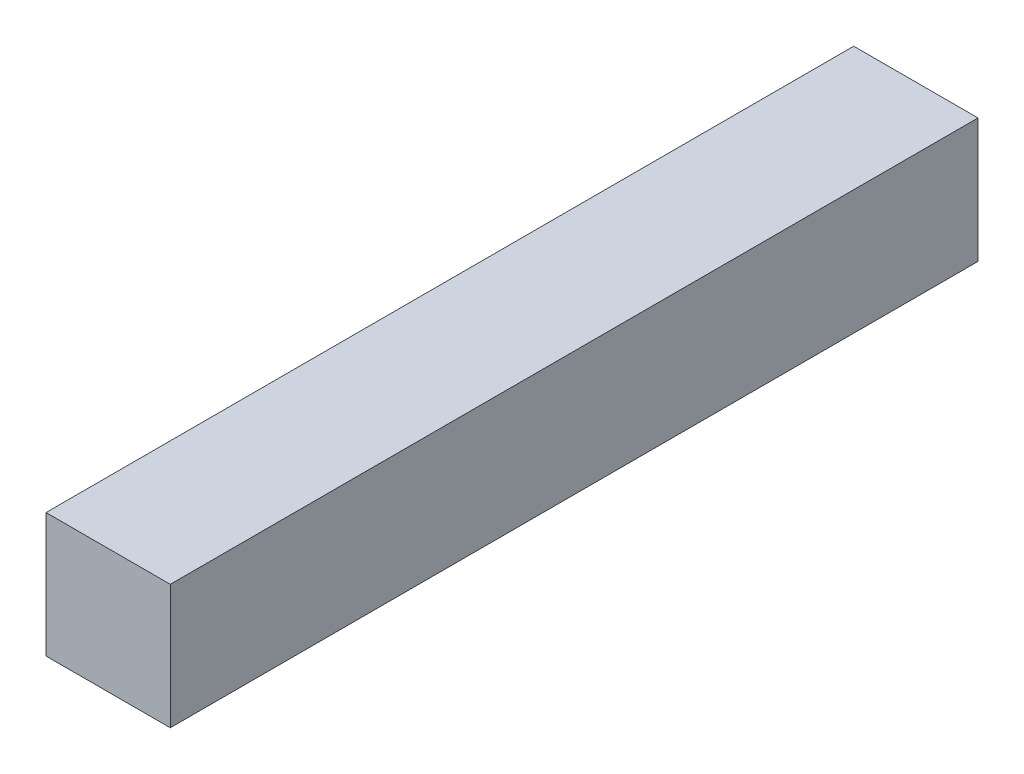
ISO-10303-21;
HEADER;
FILE_DESCRIPTION(('STEP AP214'),'2;1');
FILE_NAME('part.step','',(''),(''),'','','');
FILE_SCHEMA(('AUTOMOTIVE_DESIGN { 1 0 10303 214 1 1 1 1 }'));
ENDSEC;
DATA;
#1=APPLICATION_CONTEXT('core data for automotive mechanical design processes');
#2=APPLICATION_PROTOCOL_DEFINITION('international standard','automotive_design',2000,#1);
#3=PRODUCT_CONTEXT('',#1,'mechanical');
#4=PRODUCT('Part','Part','',(#3));
#5=PRODUCT_RELATED_PRODUCT_CATEGORY('part','',(#4));
#6=PRODUCT_DEFINITION_FORMATION('','',#4);
#7=PRODUCT_DEFINITION_CONTEXT('part definition',#1,'design');
#8=PRODUCT_DEFINITION('design','',#6,#7);
#9=PRODUCT_DEFINITION_SHAPE('','',#8);
#10=(LENGTH_UNIT() NAMED_UNIT(*) SI_UNIT(.MILLI.,.METRE.));
#11=(NAMED_UNIT(*) PLANE_ANGLE_UNIT() SI_UNIT($,.RADIAN.));
#12=(NAMED_UNIT(*) SI_UNIT($,.STERADIAN.) SOLID_ANGLE_UNIT());
#13=UNCERTAINTY_MEASURE_WITH_UNIT(LENGTH_MEASURE(1.E-05),#10,'distance_accuracy_value','');
#14=(GEOMETRIC_REPRESENTATION_CONTEXT(3) GLOBAL_UNCERTAINTY_ASSIGNED_CONTEXT((#13)) GLOBAL_UNIT_ASSIGNED_CONTEXT((#10,
#11,#12)) REPRESENTATION_CONTEXT('',''));
#15=CARTESIAN_POINT('',(0.,0.,0.));
#16=DIRECTION('',(0.,0.,1.));
#17=DIRECTION('',(1.,0.,0.));
#18=AXIS2_PLACEMENT_3D('',#15,#16,#17);
#19=CARTESIAN_POINT('',(10.,-10.,130.));
#20=DIRECTION('',(-1.,0.,0.));
#21=DIRECTION('',(0.,-1.,0.));
#22=AXIS2_PLACEMENT_3D('',#19,#20,#21);
#23=PLANE('',#22);
#24=DIRECTION('',(0.,1.,0.));
#25=VECTOR('',#24,1.);
#26=CARTESIAN_POINT('',(10.,-10.,0.));
#27=LINE('',#26,#25);
#28=CARTESIAN_POINT('',(10.,-10.,0.));
#29=VERTEX_POINT('',#28);
#30=CARTESIAN_POINT('',(10.,10.,0.));
#31=VERTEX_POINT('',#30);
#32=EDGE_CURVE('E107',#29,#31,#27,.T.);
#33=ORIENTED_EDGE('',*,*,#32,.T.);
#34=DIRECTION('',(0.,0.,-1.));
#35=VECTOR('',#34,1.);
#36=CARTESIAN_POINT('',(10.,10.,130.));
#37=LINE('',#36,#35);
#38=CARTESIAN_POINT('',(10.,10.,130.));
#39=VERTEX_POINT('',#38);
#40=EDGE_CURVE('E11',#39,#31,#37,.T.);
#41=ORIENTED_EDGE('',*,*,#40,.F.);
#42=DIRECTION('',(0.,1.,0.));
#43=VECTOR('',#42,1.);
#44=CARTESIAN_POINT('',(10.,-10.,130.));
#45=LINE('',#44,#43);
#46=CARTESIAN_POINT('',(10.,-10.,130.));
#47=VERTEX_POINT('',#46);
#48=EDGE_CURVE('E91',#47,#39,#45,.T.);
#49=ORIENTED_EDGE('',*,*,#48,.F.);
#50=DIRECTION('',(0.,0.,-1.));
#51=VECTOR('',#50,1.);
#52=CARTESIAN_POINT('',(10.,-10.,130.));
#53=LINE('',#52,#51);
#54=EDGE_CURVE('E103',#47,#29,#53,.T.);
#55=ORIENTED_EDGE('',*,*,#54,.T.);
#56=EDGE_LOOP('',(#33,#41,#49,#55));
#57=FACE_BOUND('',#56,.T.);
#58=ADVANCED_FACE('F39',(#57),#23,.F.);
#59=CARTESIAN_POINT('',(-10.,10.,130.));
#60=DIRECTION('',(0.,-1.,0.));
#61=DIRECTION('',(1.,0.,0.));
#62=AXIS2_PLACEMENT_3D('',#59,#60,#61);
#63=PLANE('',#62);
#64=DIRECTION('',(-1.,0.,0.));
#65=VECTOR('',#64,1.);
#66=CARTESIAN_POINT('',(-10.,10.,0.));
#67=LINE('',#66,#65);
#68=CARTESIAN_POINT('',(-10.,10.,0.));
#69=VERTEX_POINT('',#68);
#70=EDGE_CURVE('E96',#31,#69,#67,.T.);
#71=ORIENTED_EDGE('',*,*,#70,.T.);
#72=DIRECTION('',(0.,0.,-1.));
#73=VECTOR('',#72,1.);
#74=CARTESIAN_POINT('',(-10.,10.,130.));
#75=LINE('',#74,#73);
#76=CARTESIAN_POINT('',(-10.,10.,130.));
#77=VERTEX_POINT('',#76);
#78=EDGE_CURVE('E48',#77,#69,#75,.T.);
#79=ORIENTED_EDGE('',*,*,#78,.F.);
#80=DIRECTION('',(-1.,0.,0.));
#81=VECTOR('',#80,1.);
#82=CARTESIAN_POINT('',(-10.,10.,130.));
#83=LINE('',#82,#81);
#84=EDGE_CURVE('E86',#39,#77,#83,.T.);
#85=ORIENTED_EDGE('',*,*,#84,.F.);
#86=ORIENTED_EDGE('',*,*,#40,.T.);
#87=EDGE_LOOP('',(#71,#79,#85,#86));
#88=FACE_BOUND('',#87,.T.);
#89=ADVANCED_FACE('F95',(#88),#63,.F.);
#90=CARTESIAN_POINT('',(-10.,-10.,130.));
#91=DIRECTION('',(1.,0.,0.));
#92=DIRECTION('',(0.,0.,-1.));
#93=AXIS2_PLACEMENT_3D('',#90,#91,#92);
#94=PLANE('',#93);
#95=DIRECTION('',(0.,-1.,0.));
#96=VECTOR('',#95,1.);
#97=CARTESIAN_POINT('',(-10.,-10.,0.));
#98=LINE('',#97,#96);
#99=CARTESIAN_POINT('',(-10.,-10.,0.));
#100=VERTEX_POINT('',#99);
#101=EDGE_CURVE('E73',#69,#100,#98,.T.);
#102=ORIENTED_EDGE('',*,*,#101,.T.);
#103=DIRECTION('',(0.,0.,-1.));
#104=VECTOR('',#103,1.);
#105=CARTESIAN_POINT('',(-10.,-10.,130.));
#106=LINE('',#105,#104);
#107=CARTESIAN_POINT('',(-10.,-10.,130.));
#108=VERTEX_POINT('',#107);
#109=EDGE_CURVE('E98',#108,#100,#106,.T.);
#110=ORIENTED_EDGE('',*,*,#109,.F.);
#111=DIRECTION('',(0.,-1.,0.));
#112=VECTOR('',#111,1.);
#113=CARTESIAN_POINT('',(-10.,-10.,130.));
#114=LINE('',#113,#112);
#115=EDGE_CURVE('E89',#77,#108,#114,.T.);
#116=ORIENTED_EDGE('',*,*,#115,.F.);
#117=ORIENTED_EDGE('',*,*,#78,.T.);
#118=EDGE_LOOP('',(#102,#110,#116,#117));
#119=FACE_BOUND('',#118,.T.);
#120=ADVANCED_FACE('F99',(#119),#94,.F.);
#121=CARTESIAN_POINT('',(-10.,-10.,130.));
#122=DIRECTION('',(0.,1.,0.));
#123=DIRECTION('',(-1.,0.,0.));
#124=AXIS2_PLACEMENT_3D('',#121,#122,#123);
#125=PLANE('',#124);
#126=DIRECTION('',(1.,0.,0.));
#127=VECTOR('',#126,1.);
#128=CARTESIAN_POINT('',(-10.,-10.,0.));
#129=LINE('',#128,#127);
#130=EDGE_CURVE('E79',#100,#29,#129,.T.);
#131=ORIENTED_EDGE('',*,*,#130,.T.);
#132=ORIENTED_EDGE('',*,*,#54,.F.);
#133=DIRECTION('',(1.,0.,0.));
#134=VECTOR('',#133,1.);
#135=CARTESIAN_POINT('',(-10.,-10.,130.));
#136=LINE('',#135,#134);
#137=EDGE_CURVE('E56',#108,#47,#136,.T.);
#138=ORIENTED_EDGE('',*,*,#137,.F.);
#139=ORIENTED_EDGE('',*,*,#109,.T.);
#140=EDGE_LOOP('',(#131,#132,#138,#139));
#141=FACE_BOUND('',#140,.T.);
#142=ADVANCED_FACE('F120',(#141),#125,.F.);
#143=CARTESIAN_POINT('',(0.,0.,130.));
#144=DIRECTION('',(0.,0.,-1.));
#145=DIRECTION('',(-1.,0.,0.));
#146=AXIS2_PLACEMENT_3D('',#143,#144,#145);
#147=PLANE('',#146);
#148=ORIENTED_EDGE('',*,*,#48,.T.);
#149=ORIENTED_EDGE('',*,*,#84,.T.);
#150=ORIENTED_EDGE('',*,*,#115,.T.);
#151=ORIENTED_EDGE('',*,*,#137,.T.);
#152=EDGE_LOOP('',(#148,#149,#150,#151));
#153=FACE_BOUND('',#152,.T.);
#154=ADVANCED_FACE('F87',(#153),#147,.F.);
#155=CARTESIAN_POINT('',(0.,0.,0.));
#156=DIRECTION('',(0.,0.,-1.));
#157=DIRECTION('',(-1.,0.,0.));
#158=AXIS2_PLACEMENT_3D('',#155,#156,#157);
#159=PLANE('',#158);
#160=ORIENTED_EDGE('',*,*,#32,.F.);
#161=ORIENTED_EDGE('',*,*,#130,.F.);
#162=ORIENTED_EDGE('',*,*,#101,.F.);
#163=ORIENTED_EDGE('',*,*,#70,.F.);
#164=EDGE_LOOP('',(#160,#161,#162,#163));
#165=FACE_BOUND('',#164,.T.);
#166=ADVANCED_FACE('F123',(#165),#159,.T.);
#167=CLOSED_SHELL('',(#58,#89,#120,#142,#154,#166));
#168=MANIFOLD_SOLID_BREP('B2',#167);
#169=ADVANCED_BREP_SHAPE_REPRESENTATION('',(#18,#168),#14);
#170=SHAPE_DEFINITION_REPRESENTATION(#9,#169);
ENDSEC;
END-ISO-10303-21;
